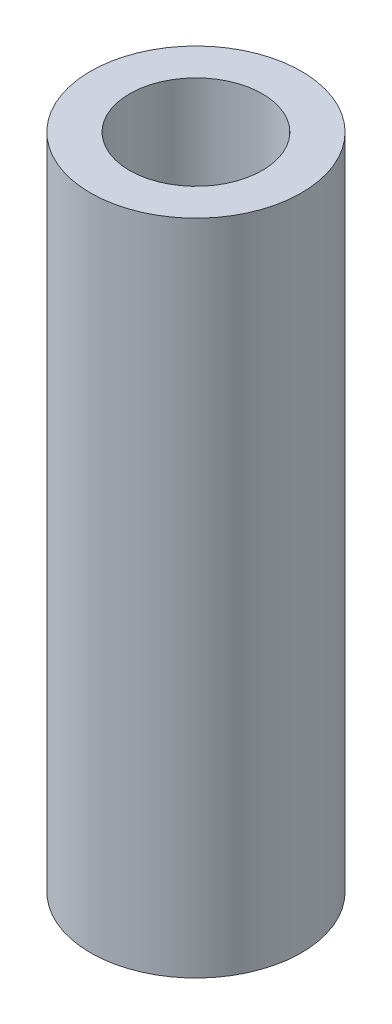
ISO-10303-21;
HEADER;
FILE_DESCRIPTION(('STEP AP214'),'2;1');
FILE_NAME('part.step','',(''),(''),'','','');
FILE_SCHEMA(('AUTOMOTIVE_DESIGN { 1 0 10303 214 1 1 1 1 }'));
ENDSEC;
DATA;
#1=APPLICATION_CONTEXT('core data for automotive mechanical design processes');
#2=APPLICATION_PROTOCOL_DEFINITION('international standard','automotive_design',2000,#1);
#3=PRODUCT_CONTEXT('',#1,'mechanical');
#4=PRODUCT('Part','Part','',(#3));
#5=PRODUCT_RELATED_PRODUCT_CATEGORY('part','',(#4));
#6=PRODUCT_DEFINITION_FORMATION('','',#4);
#7=PRODUCT_DEFINITION_CONTEXT('part definition',#1,'design');
#8=PRODUCT_DEFINITION('design','',#6,#7);
#9=PRODUCT_DEFINITION_SHAPE('','',#8);
#10=(LENGTH_UNIT() NAMED_UNIT(*) SI_UNIT(.MILLI.,.METRE.));
#11=(NAMED_UNIT(*) PLANE_ANGLE_UNIT() SI_UNIT($,.RADIAN.));
#12=(NAMED_UNIT(*) SI_UNIT($,.STERADIAN.) SOLID_ANGLE_UNIT());
#13=UNCERTAINTY_MEASURE_WITH_UNIT(LENGTH_MEASURE(1.E-05),#10,'distance_accuracy_value','');
#14=(GEOMETRIC_REPRESENTATION_CONTEXT(3) GLOBAL_UNCERTAINTY_ASSIGNED_CONTEXT((#13)) GLOBAL_UNIT_ASSIGNED_CONTEXT((#10,
#11,#12)) REPRESENTATION_CONTEXT('',''));
#15=CARTESIAN_POINT('',(0.,0.,0.));
#16=DIRECTION('',(0.,0.,1.));
#17=DIRECTION('',(1.,0.,0.));
#18=AXIS2_PLACEMENT_3D('',#15,#16,#17);
#19=CARTESIAN_POINT('',(0.,-19.812,0.));
#20=DIRECTION('',(0.,1.,0.));
#21=DIRECTION('',(0.,0.,1.));
#22=AXIS2_PLACEMENT_3D('',#19,#20,#21);
#23=CYLINDRICAL_SURFACE('',#22,3.175);
#24=CARTESIAN_POINT('',(0.,-19.812,0.));
#25=DIRECTION('',(0.,1.,0.));
#26=DIRECTION('',(0.,0.,1.));
#27=AXIS2_PLACEMENT_3D('',#24,#25,#26);
#28=CIRCLE('',#27,3.175);
#29=CARTESIAN_POINT('',(0.,-19.812,3.175));
#30=VERTEX_POINT('',#29);
#31=EDGE_CURVE('E10',#30,#30,#28,.T.);
#32=ORIENTED_EDGE('',*,*,#31,.T.);
#33=EDGE_LOOP('',(#32));
#34=FACE_BOUND('',#33,.T.);
#35=CARTESIAN_POINT('',(0.,0.,0.));
#36=DIRECTION('',(0.,1.,0.));
#37=DIRECTION('',(0.,0.,1.));
#38=AXIS2_PLACEMENT_3D('',#35,#36,#37);
#39=CIRCLE('',#38,3.175);
#40=CARTESIAN_POINT('',(0.,0.,3.175));
#41=VERTEX_POINT('',#40);
#42=EDGE_CURVE('E40',#41,#41,#39,.T.);
#43=ORIENTED_EDGE('',*,*,#42,.F.);
#44=EDGE_LOOP('',(#43));
#45=FACE_BOUND('',#44,.T.);
#46=ADVANCED_FACE('F37',(#34,#45),#23,.T.);
#47=CARTESIAN_POINT('',(0.,-19.812,0.));
#48=DIRECTION('',(0.,1.,0.));
#49=DIRECTION('',(0.,0.,1.));
#50=AXIS2_PLACEMENT_3D('',#47,#48,#49);
#51=PLANE('',#50);
#52=CARTESIAN_POINT('',(0.,-19.812,0.));
#53=DIRECTION('',(0.,1.,0.));
#54=DIRECTION('',(0.,0.,1.));
#55=AXIS2_PLACEMENT_3D('',#52,#53,#54);
#56=CIRCLE('',#55,2.);
#57=CARTESIAN_POINT('',(0.,-19.812,2.));
#58=VERTEX_POINT('',#57);
#59=EDGE_CURVE('E49',#58,#58,#56,.T.);
#60=ORIENTED_EDGE('',*,*,#59,.T.);
#61=EDGE_LOOP('',(#60));
#62=FACE_BOUND('',#61,.T.);
#63=ORIENTED_EDGE('',*,*,#31,.F.);
#64=EDGE_LOOP('',(#63));
#65=FACE_BOUND('',#64,.T.);
#66=ADVANCED_FACE('F59',(#62,#65),#51,.F.);
#67=CARTESIAN_POINT('',(0.,0.,0.));
#68=DIRECTION('',(0.,1.,0.));
#69=DIRECTION('',(0.,0.,1.));
#70=AXIS2_PLACEMENT_3D('',#67,#68,#69);
#71=PLANE('',#70);
#72=CARTESIAN_POINT('',(0.,0.,0.));
#73=DIRECTION('',(0.,1.,0.));
#74=DIRECTION('',(0.,0.,1.));
#75=AXIS2_PLACEMENT_3D('',#72,#73,#74);
#76=CIRCLE('',#75,2.);
#77=CARTESIAN_POINT('',(0.,0.,2.));
#78=VERTEX_POINT('',#77);
#79=EDGE_CURVE('E51',#78,#78,#76,.T.);
#80=ORIENTED_EDGE('',*,*,#79,.F.);
#81=EDGE_LOOP('',(#80));
#82=FACE_BOUND('',#81,.T.);
#83=ORIENTED_EDGE('',*,*,#42,.T.);
#84=EDGE_LOOP('',(#83));
#85=FACE_BOUND('',#84,.T.);
#86=ADVANCED_FACE('F65',(#82,#85),#71,.T.);
#87=CARTESIAN_POINT('',(0.,-19.812,0.));
#88=DIRECTION('',(0.,1.,0.));
#89=DIRECTION('',(0.,0.,1.));
#90=AXIS2_PLACEMENT_3D('',#87,#88,#89);
#91=CYLINDRICAL_SURFACE('',#90,2.);
#92=ORIENTED_EDGE('',*,*,#59,.F.);
#93=EDGE_LOOP('',(#92));
#94=FACE_BOUND('',#93,.T.);
#95=ORIENTED_EDGE('',*,*,#79,.T.);
#96=EDGE_LOOP('',(#95));
#97=FACE_BOUND('',#96,.T.);
#98=ADVANCED_FACE('F62',(#94,#97),#91,.F.);
#99=CLOSED_SHELL('',(#46,#66,#86,#98));
#100=MANIFOLD_SOLID_BREP('B2',#99);
#101=ADVANCED_BREP_SHAPE_REPRESENTATION('',(#18,#100),#14);
#102=SHAPE_DEFINITION_REPRESENTATION(#9,#101);
ENDSEC;
END-ISO-10303-21;
